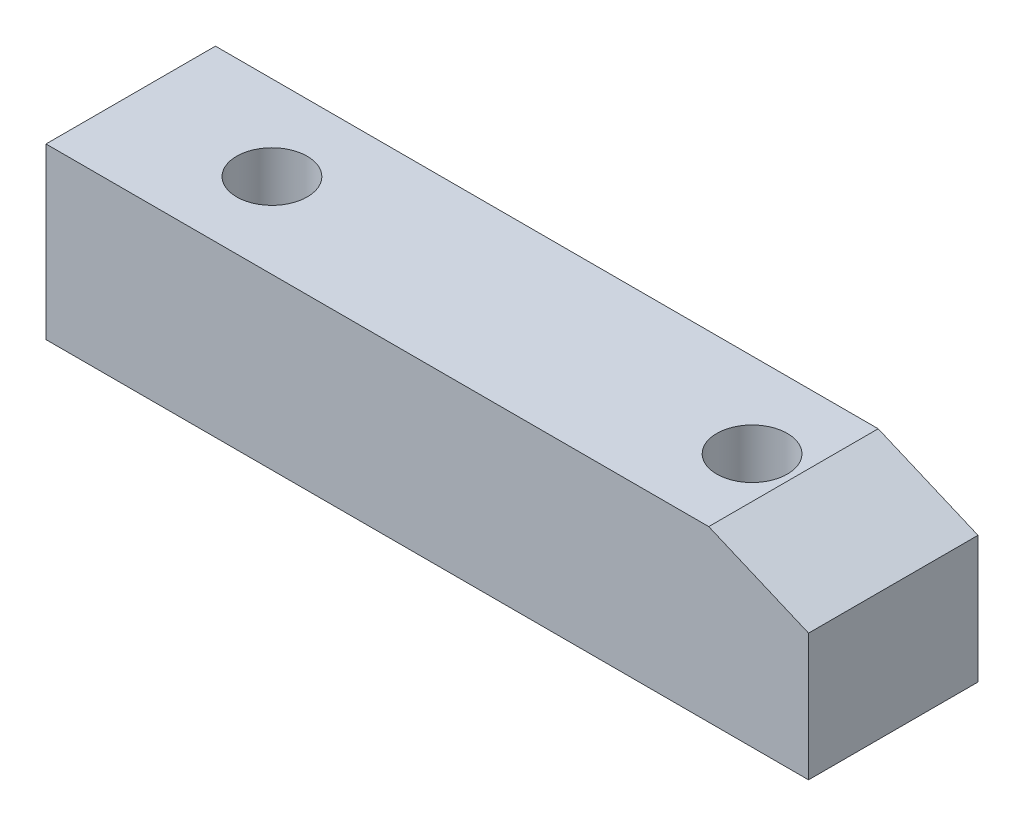
ISO-10303-21;
HEADER;
FILE_DESCRIPTION(('STEP AP214'),'2;1');
FILE_NAME('part.step','',(''),(''),'','','');
FILE_SCHEMA(('AUTOMOTIVE_DESIGN { 1 0 10303 214 1 1 1 1 }'));
ENDSEC;
DATA;
#1=APPLICATION_CONTEXT('core data for automotive mechanical design processes');
#2=APPLICATION_PROTOCOL_DEFINITION('international standard','automotive_design',2000,#1);
#3=PRODUCT_CONTEXT('',#1,'mechanical');
#4=PRODUCT('Part','Part','',(#3));
#5=PRODUCT_RELATED_PRODUCT_CATEGORY('part','',(#4));
#6=PRODUCT_DEFINITION_FORMATION('','',#4);
#7=PRODUCT_DEFINITION_CONTEXT('part definition',#1,'design');
#8=PRODUCT_DEFINITION('design','',#6,#7);
#9=PRODUCT_DEFINITION_SHAPE('','',#8);
#10=(LENGTH_UNIT() NAMED_UNIT(*) SI_UNIT(.MILLI.,.METRE.));
#11=(NAMED_UNIT(*) PLANE_ANGLE_UNIT() SI_UNIT($,.RADIAN.));
#12=(NAMED_UNIT(*) SI_UNIT($,.STERADIAN.) SOLID_ANGLE_UNIT());
#13=UNCERTAINTY_MEASURE_WITH_UNIT(LENGTH_MEASURE(1.E-05),#10,'distance_accuracy_value','');
#14=(GEOMETRIC_REPRESENTATION_CONTEXT(3) GLOBAL_UNCERTAINTY_ASSIGNED_CONTEXT((#13)) GLOBAL_UNIT_ASSIGNED_CONTEXT((#10,
#11,#12)) REPRESENTATION_CONTEXT('',''));
#15=CARTESIAN_POINT('',(0.,0.,0.));
#16=DIRECTION('',(0.,0.,1.));
#17=DIRECTION('',(1.,0.,0.));
#18=AXIS2_PLACEMENT_3D('',#15,#16,#17);
#19=CARTESIAN_POINT('',(0.,0.,6.));
#20=DIRECTION('',(1.,0.,0.));
#21=DIRECTION('',(0.,1.,0.));
#22=AXIS2_PLACEMENT_3D('',#19,#20,#21);
#23=PLANE('',#22);
#24=DIRECTION('',(0.,-1.,0.));
#25=VECTOR('',#24,1.);
#26=CARTESIAN_POINT('',(0.,0.,0.));
#27=LINE('',#26,#25);
#28=CARTESIAN_POINT('',(0.,0.,0.));
#29=VERTEX_POINT('',#28);
#30=CARTESIAN_POINT('',(0.,-6.,0.));
#31=VERTEX_POINT('',#30);
#32=EDGE_CURVE('E112',#29,#31,#27,.T.);
#33=ORIENTED_EDGE('',*,*,#32,.T.);
#34=DIRECTION('',(0.,0.,-1.));
#35=VECTOR('',#34,1.);
#36=CARTESIAN_POINT('',(0.,-6.,6.));
#37=LINE('',#36,#35);
#38=CARTESIAN_POINT('',(0.,-6.,6.));
#39=VERTEX_POINT('',#38);
#40=EDGE_CURVE('E92',#39,#31,#37,.T.);
#41=ORIENTED_EDGE('',*,*,#40,.F.);
#42=DIRECTION('',(0.,-1.,0.));
#43=VECTOR('',#42,1.);
#44=CARTESIAN_POINT('',(0.,0.,6.));
#45=LINE('',#44,#43);
#46=CARTESIAN_POINT('',(0.,0.,6.));
#47=VERTEX_POINT('',#46);
#48=EDGE_CURVE('E99',#47,#39,#45,.T.);
#49=ORIENTED_EDGE('',*,*,#48,.F.);
#50=DIRECTION('',(0.,0.,-1.));
#51=VECTOR('',#50,1.);
#52=CARTESIAN_POINT('',(0.,0.,6.));
#53=LINE('',#52,#51);
#54=EDGE_CURVE('E121',#47,#29,#53,.T.);
#55=ORIENTED_EDGE('',*,*,#54,.T.);
#56=EDGE_LOOP('',(#33,#41,#49,#55));
#57=FACE_BOUND('',#56,.T.);
#58=ADVANCED_FACE('F40',(#57),#23,.F.);
#59=CARTESIAN_POINT('',(0.,-6.,6.));
#60=DIRECTION('',(0.,1.,0.));
#61=DIRECTION('',(0.,0.,1.));
#62=AXIS2_PLACEMENT_3D('',#59,#60,#61);
#63=PLANE('',#62);
#64=CARTESIAN_POINT('',(5.,-6.,3.));
#65=DIRECTION('',(0.,1.,0.));
#66=DIRECTION('',(0.,0.,1.));
#67=AXIS2_PLACEMENT_3D('',#64,#65,#66);
#68=CIRCLE('',#67,1.25);
#69=CARTESIAN_POINT('',(5.,-6.,4.25));
#70=VERTEX_POINT('',#69);
#71=EDGE_CURVE('E125',#70,#70,#68,.T.);
#72=ORIENTED_EDGE('',*,*,#71,.T.);
#73=EDGE_LOOP('',(#72));
#74=FACE_BOUND('',#73,.T.);
#75=CARTESIAN_POINT('',(22.,-6.,3.));
#76=DIRECTION('',(0.,1.,0.));
#77=DIRECTION('',(0.,0.,1.));
#78=AXIS2_PLACEMENT_3D('',#75,#76,#77);
#79=CIRCLE('',#78,1.25);
#80=CARTESIAN_POINT('',(22.,-6.,4.25));
#81=VERTEX_POINT('',#80);
#82=EDGE_CURVE('E143',#81,#81,#79,.T.);
#83=ORIENTED_EDGE('',*,*,#82,.T.);
#84=EDGE_LOOP('',(#83));
#85=FACE_BOUND('',#84,.T.);
#86=DIRECTION('',(1.,0.,0.));
#87=VECTOR('',#86,1.);
#88=CARTESIAN_POINT('',(0.,-6.,0.));
#89=LINE('',#88,#87);
#90=CARTESIAN_POINT('',(27.,-6.,0.));
#91=VERTEX_POINT('',#90);
#92=EDGE_CURVE('E160',#31,#91,#89,.T.);
#93=ORIENTED_EDGE('',*,*,#92,.T.);
#94=DIRECTION('',(0.,0.,-1.));
#95=VECTOR('',#94,1.);
#96=CARTESIAN_POINT('',(27.,-6.,6.));
#97=LINE('',#96,#95);
#98=CARTESIAN_POINT('',(27.,-6.,6.));
#99=VERTEX_POINT('',#98);
#100=EDGE_CURVE('E95',#99,#91,#97,.T.);
#101=ORIENTED_EDGE('',*,*,#100,.F.);
#102=DIRECTION('',(1.,0.,0.));
#103=VECTOR('',#102,1.);
#104=CARTESIAN_POINT('',(0.,-6.,6.));
#105=LINE('',#104,#103);
#106=EDGE_CURVE('E88',#39,#99,#105,.T.);
#107=ORIENTED_EDGE('',*,*,#106,.F.);
#108=ORIENTED_EDGE('',*,*,#40,.T.);
#109=EDGE_LOOP('',(#93,#101,#107,#108));
#110=FACE_BOUND('',#109,.T.);
#111=ADVANCED_FACE('F90',(#74,#85,#110),#63,.F.);
#112=CARTESIAN_POINT('',(27.,0.,6.));
#113=DIRECTION('',(-1.,0.,0.));
#114=DIRECTION('',(0.,0.,1.));
#115=AXIS2_PLACEMENT_3D('',#112,#113,#114);
#116=PLANE('',#115);
#117=DIRECTION('',(0.,1.,0.));
#118=VECTOR('',#117,1.);
#119=CARTESIAN_POINT('',(27.,0.,0.));
#120=LINE('',#119,#118);
#121=CARTESIAN_POINT('',(27.,-1.5,0.));
#122=VERTEX_POINT('',#121);
#123=EDGE_CURVE('E163',#91,#122,#120,.T.);
#124=ORIENTED_EDGE('',*,*,#123,.T.);
#125=DIRECTION('',(0.,0.,1.));
#126=VECTOR('',#125,1.);
#127=CARTESIAN_POINT('',(27.,-1.5,6.));
#128=LINE('',#127,#126);
#129=CARTESIAN_POINT('',(27.,-1.5,6.));
#130=VERTEX_POINT('',#129);
#131=EDGE_CURVE('E49',#122,#130,#128,.T.);
#132=ORIENTED_EDGE('',*,*,#131,.T.);
#133=DIRECTION('',(0.,1.,0.));
#134=VECTOR('',#133,1.);
#135=CARTESIAN_POINT('',(27.,0.,6.));
#136=LINE('',#135,#134);
#137=EDGE_CURVE('E98',#99,#130,#136,.T.);
#138=ORIENTED_EDGE('',*,*,#137,.F.);
#139=ORIENTED_EDGE('',*,*,#100,.T.);
#140=EDGE_LOOP('',(#124,#132,#138,#139));
#141=FACE_BOUND('',#140,.T.);
#142=ADVANCED_FACE('F171',(#141),#116,.F.);
#143=CARTESIAN_POINT('',(0.,0.,6.));
#144=DIRECTION('',(0.,-1.,0.));
#145=DIRECTION('',(0.,0.,-1.));
#146=AXIS2_PLACEMENT_3D('',#143,#144,#145);
#147=PLANE('',#146);
#148=CARTESIAN_POINT('',(5.,0.,3.));
#149=DIRECTION('',(0.,1.,0.));
#150=DIRECTION('',(0.,0.,1.));
#151=AXIS2_PLACEMENT_3D('',#148,#149,#150);
#152=CIRCLE('',#151,1.25);
#153=CARTESIAN_POINT('',(5.,0.,4.25));
#154=VERTEX_POINT('',#153);
#155=EDGE_CURVE('E129',#154,#154,#152,.T.);
#156=ORIENTED_EDGE('',*,*,#155,.F.);
#157=EDGE_LOOP('',(#156));
#158=FACE_BOUND('',#157,.T.);
#159=CARTESIAN_POINT('',(22.,0.,3.));
#160=DIRECTION('',(0.,1.,0.));
#161=DIRECTION('',(0.,0.,1.));
#162=AXIS2_PLACEMENT_3D('',#159,#160,#161);
#163=CIRCLE('',#162,1.25);
#164=CARTESIAN_POINT('',(22.,0.,4.25));
#165=VERTEX_POINT('',#164);
#166=EDGE_CURVE('E128',#165,#165,#163,.T.);
#167=ORIENTED_EDGE('',*,*,#166,.F.);
#168=EDGE_LOOP('',(#167));
#169=FACE_BOUND('',#168,.T.);
#170=DIRECTION('',(-1.,0.,0.));
#171=VECTOR('',#170,1.);
#172=CARTESIAN_POINT('',(0.,0.,6.));
#173=LINE('',#172,#171);
#174=CARTESIAN_POINT('',(23.4662214512644,0.,6.));
#175=VERTEX_POINT('',#174);
#176=EDGE_CURVE('E104',#175,#47,#173,.T.);
#177=ORIENTED_EDGE('',*,*,#176,.F.);
#178=DIRECTION('',(0.,0.,-1.));
#179=VECTOR('',#178,1.);
#180=CARTESIAN_POINT('',(23.4662214512644,0.,6.));
#181=LINE('',#180,#179);
#182=CARTESIAN_POINT('',(23.4662214512644,0.,0.));
#183=VERTEX_POINT('',#182);
#184=EDGE_CURVE('E114',#175,#183,#181,.T.);
#185=ORIENTED_EDGE('',*,*,#184,.T.);
#186=DIRECTION('',(-1.,0.,0.));
#187=VECTOR('',#186,1.);
#188=CARTESIAN_POINT('',(0.,0.,0.));
#189=LINE('',#188,#187);
#190=EDGE_CURVE('E109',#183,#29,#189,.T.);
#191=ORIENTED_EDGE('',*,*,#190,.T.);
#192=ORIENTED_EDGE('',*,*,#54,.F.);
#193=EDGE_LOOP('',(#177,#185,#191,#192));
#194=FACE_BOUND('',#193,.T.);
#195=ADVANCED_FACE('F175',(#158,#169,#194),#147,.F.);
#196=CARTESIAN_POINT('',(0.,0.,6.));
#197=DIRECTION('',(0.,0.,1.));
#198=DIRECTION('',(1.,0.,0.));
#199=AXIS2_PLACEMENT_3D('',#196,#197,#198);
#200=PLANE('',#199);
#201=ORIENTED_EDGE('',*,*,#137,.T.);
#202=DIRECTION('',(0.920504853452439,-0.390731128489276,0.));
#203=VECTOR('',#202,1.);
#204=CARTESIAN_POINT('',(3.58260714854959,8.44009352672759,6.));
#205=LINE('',#204,#203);
#206=EDGE_CURVE('E11',#130,#175,#205,.F.);
#207=ORIENTED_EDGE('',*,*,#206,.T.);
#208=ORIENTED_EDGE('',*,*,#176,.T.);
#209=ORIENTED_EDGE('',*,*,#48,.T.);
#210=ORIENTED_EDGE('',*,*,#106,.T.);
#211=EDGE_LOOP('',(#201,#207,#208,#209,#210));
#212=FACE_BOUND('',#211,.T.);
#213=ADVANCED_FACE('F102',(#212),#200,.T.);
#214=CARTESIAN_POINT('',(0.,0.,0.));
#215=DIRECTION('',(0.,0.,1.));
#216=DIRECTION('',(1.,0.,0.));
#217=AXIS2_PLACEMENT_3D('',#214,#215,#216);
#218=PLANE('',#217);
#219=ORIENTED_EDGE('',*,*,#190,.F.);
#220=DIRECTION('',(-0.920504853452439,0.390731128489276,0.));
#221=VECTOR('',#220,1.);
#222=CARTESIAN_POINT('',(23.4662214512644,0.,0.));
#223=LINE('',#222,#221);
#224=EDGE_CURVE('E63',#183,#122,#223,.F.);
#225=ORIENTED_EDGE('',*,*,#224,.T.);
#226=ORIENTED_EDGE('',*,*,#123,.F.);
#227=ORIENTED_EDGE('',*,*,#92,.F.);
#228=ORIENTED_EDGE('',*,*,#32,.F.);
#229=EDGE_LOOP('',(#219,#225,#226,#227,#228));
#230=FACE_BOUND('',#229,.T.);
#231=ADVANCED_FACE('F170',(#230),#218,.F.);
#232=CARTESIAN_POINT('',(22.,0.,3.));
#233=DIRECTION('',(0.,1.,0.));
#234=DIRECTION('',(0.,0.,1.));
#235=AXIS2_PLACEMENT_3D('',#232,#233,#234);
#236=CYLINDRICAL_SURFACE('',#235,1.25);
#237=ORIENTED_EDGE('',*,*,#166,.T.);
#238=EDGE_LOOP('',(#237));
#239=FACE_BOUND('',#238,.T.);
#240=ORIENTED_EDGE('',*,*,#82,.F.);
#241=EDGE_LOOP('',(#240));
#242=FACE_BOUND('',#241,.T.);
#243=ADVANCED_FACE('F197',(#239,#242),#236,.F.);
#244=CARTESIAN_POINT('',(5.,0.,3.));
#245=DIRECTION('',(0.,1.,0.));
#246=DIRECTION('',(0.,0.,1.));
#247=AXIS2_PLACEMENT_3D('',#244,#245,#246);
#248=CYLINDRICAL_SURFACE('',#247,1.25);
#249=ORIENTED_EDGE('',*,*,#155,.T.);
#250=EDGE_LOOP('',(#249));
#251=FACE_BOUND('',#250,.T.);
#252=ORIENTED_EDGE('',*,*,#71,.F.);
#253=EDGE_LOOP('',(#252));
#254=FACE_BOUND('',#253,.T.);
#255=ADVANCED_FACE('F199',(#251,#254),#248,.F.);
#256=CARTESIAN_POINT('',(23.4662214512644,0.,6.));
#257=DIRECTION('',(-0.390731128489276,-0.920504853452439,0.));
#258=DIRECTION('',(0.,0.,-1.));
#259=AXIS2_PLACEMENT_3D('',#256,#257,#258);
#260=PLANE('',#259);
#261=ORIENTED_EDGE('',*,*,#206,.F.);
#262=ORIENTED_EDGE('',*,*,#131,.F.);
#263=ORIENTED_EDGE('',*,*,#224,.F.);
#264=ORIENTED_EDGE('',*,*,#184,.F.);
#265=EDGE_LOOP('',(#261,#262,#263,#264));
#266=FACE_BOUND('',#265,.T.);
#267=ADVANCED_FACE('F42',(#266),#260,.F.);
#268=CLOSED_SHELL('',(#58,#111,#142,#195,#213,#231,#243,#255,#267));
#269=MANIFOLD_SOLID_BREP('B2',#268);
#270=ADVANCED_BREP_SHAPE_REPRESENTATION('',(#18,#269),#14);
#271=SHAPE_DEFINITION_REPRESENTATION(#9,#270);
ENDSEC;
END-ISO-10303-21;
